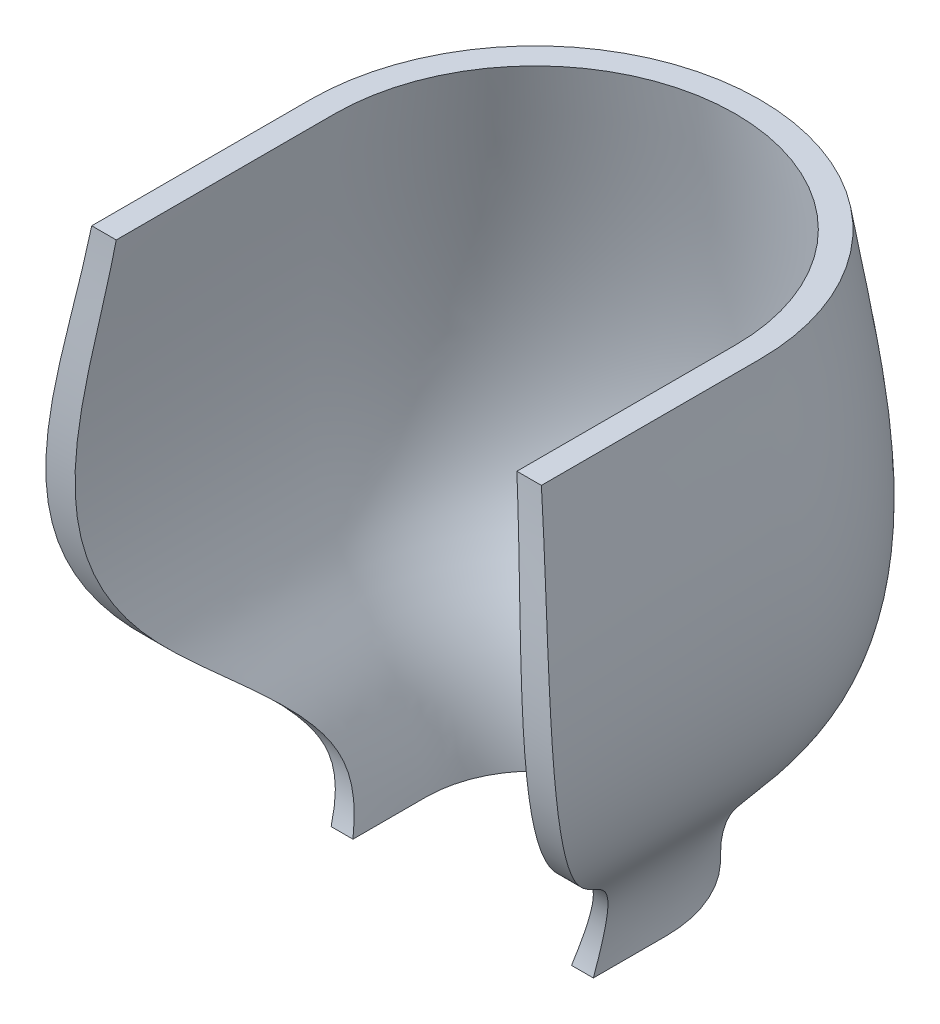
ISO-10303-21;
HEADER;
FILE_DESCRIPTION(('STEP AP214'),'2;1');
FILE_NAME('part.step','',(''),(''),'','','');
FILE_SCHEMA(('AUTOMOTIVE_DESIGN { 1 0 10303 214 1 1 1 1 }'));
ENDSEC;
DATA;
#1=APPLICATION_CONTEXT('core data for automotive mechanical design processes');
#2=APPLICATION_PROTOCOL_DEFINITION('international standard','automotive_design',2000,#1);
#3=PRODUCT_CONTEXT('',#1,'mechanical');
#4=PRODUCT('Part','Part','',(#3));
#5=PRODUCT_RELATED_PRODUCT_CATEGORY('part','',(#4));
#6=PRODUCT_DEFINITION_FORMATION('','',#4);
#7=PRODUCT_DEFINITION_CONTEXT('part definition',#1,'design');
#8=PRODUCT_DEFINITION('design','',#6,#7);
#9=PRODUCT_DEFINITION_SHAPE('','',#8);
#10=(LENGTH_UNIT() NAMED_UNIT(*) SI_UNIT(.MILLI.,.METRE.));
#11=(NAMED_UNIT(*) PLANE_ANGLE_UNIT() SI_UNIT($,.RADIAN.));
#12=(NAMED_UNIT(*) SI_UNIT($,.STERADIAN.) SOLID_ANGLE_UNIT());
#13=UNCERTAINTY_MEASURE_WITH_UNIT(LENGTH_MEASURE(1.E-05),#10,'distance_accuracy_value','');
#14=(GEOMETRIC_REPRESENTATION_CONTEXT(3) GLOBAL_UNCERTAINTY_ASSIGNED_CONTEXT((#13)) GLOBAL_UNIT_ASSIGNED_CONTEXT((#10,
#11,#12)) REPRESENTATION_CONTEXT('',''));
#15=CARTESIAN_POINT('',(0.,0.,0.));
#16=DIRECTION('',(0.,0.,1.));
#17=DIRECTION('',(1.,0.,0.));
#18=AXIS2_PLACEMENT_3D('',#15,#16,#17);
#19=CARTESIAN_POINT('',(0.,15.,0.));
#20=DIRECTION('',(0.,1.,0.));
#21=DIRECTION('',(0.,0.,1.));
#22=AXIS2_PLACEMENT_3D('',#19,#20,#21);
#23=PLANE('',#22);
#24=CARTESIAN_POINT('',(0.,15.,0.));
#25=DIRECTION('',(0.,-1.,0.));
#26=DIRECTION('',(0.,0.,1.));
#27=AXIS2_PLACEMENT_3D('',#24,#25,#26);
#28=CIRCLE('',#27,5.5);
#29=CARTESIAN_POINT('',(-5.5,15.,0.));
#30=VERTEX_POINT('',#29);
#31=CARTESIAN_POINT('',(5.5,15.,0.));
#32=VERTEX_POINT('',#31);
#33=EDGE_CURVE('E419',#30,#32,#28,.T.);
#34=ORIENTED_EDGE('',*,*,#33,.T.);
#35=DIRECTION('',(0.,0.,1.));
#36=VECTOR('',#35,1.);
#37=CARTESIAN_POINT('',(5.5,15.,0.));
#38=LINE('',#37,#36);
#39=CARTESIAN_POINT('',(5.5,15.,6.));
#40=VERTEX_POINT('',#39);
#41=EDGE_CURVE('E12',#32,#40,#38,.T.);
#42=ORIENTED_EDGE('',*,*,#41,.T.);
#43=DIRECTION('',(1.,0.,0.));
#44=VECTOR('',#43,1.);
#45=CARTESIAN_POINT('',(6.17309138782306,15.,6.));
#46=LINE('',#45,#44);
#47=CARTESIAN_POINT('',(6.17309138782306,15.,6.));
#48=VERTEX_POINT('',#47);
#49=EDGE_CURVE('E285',#40,#48,#46,.T.);
#50=ORIENTED_EDGE('',*,*,#49,.T.);
#51=DIRECTION('',(0.,0.,-1.));
#52=VECTOR('',#51,1.);
#53=CARTESIAN_POINT('',(6.17309138782306,15.,0.));
#54=LINE('',#53,#52);
#55=CARTESIAN_POINT('',(6.17309138782306,15.,0.));
#56=VERTEX_POINT('',#55);
#57=EDGE_CURVE('E580',#48,#56,#54,.T.);
#58=ORIENTED_EDGE('',*,*,#57,.T.);
#59=CARTESIAN_POINT('',(0.,15.,0.));
#60=DIRECTION('',(0.,1.,0.));
#61=DIRECTION('',(0.,0.,-1.));
#62=AXIS2_PLACEMENT_3D('',#59,#60,#61);
#63=CIRCLE('',#62,6.17309138782306);
#64=CARTESIAN_POINT('',(-6.17309138782306,15.,0.));
#65=VERTEX_POINT('',#64);
#66=EDGE_CURVE('E569',#56,#65,#63,.T.);
#67=ORIENTED_EDGE('',*,*,#66,.T.);
#68=DIRECTION('',(0.,0.,1.));
#69=VECTOR('',#68,1.);
#70=CARTESIAN_POINT('',(-6.17309138782306,15.,0.));
#71=LINE('',#70,#69);
#72=CARTESIAN_POINT('',(-6.17309138782306,15.,6.));
#73=VERTEX_POINT('',#72);
#74=EDGE_CURVE('E558',#65,#73,#71,.T.);
#75=ORIENTED_EDGE('',*,*,#74,.T.);
#76=DIRECTION('',(1.,0.,0.));
#77=VECTOR('',#76,1.);
#78=CARTESIAN_POINT('',(-6.17309138782306,15.,6.));
#79=LINE('',#78,#77);
#80=CARTESIAN_POINT('',(-5.5,15.,6.));
#81=VERTEX_POINT('',#80);
#82=EDGE_CURVE('E299',#73,#81,#79,.T.);
#83=ORIENTED_EDGE('',*,*,#82,.T.);
#84=DIRECTION('',(0.,0.,-1.));
#85=VECTOR('',#84,1.);
#86=CARTESIAN_POINT('',(-5.5,15.,0.));
#87=LINE('',#86,#85);
#88=EDGE_CURVE('E293',#81,#30,#87,.T.);
#89=ORIENTED_EDGE('',*,*,#88,.T.);
#90=EDGE_LOOP('',(#34,#42,#50,#58,#67,#75,#83,#89));
#91=FACE_BOUND('',#90,.T.);
#92=ADVANCED_FACE('F275',(#91),#23,.T.);
#93=CARTESIAN_POINT('',(0.,0.,0.));
#94=DIRECTION('',(0.,1.,0.));
#95=DIRECTION('',(0.,0.,1.));
#96=AXIS2_PLACEMENT_3D('',#93,#94,#95);
#97=PLANE('',#96);
#98=CARTESIAN_POINT('',(0.,0.,0.));
#99=DIRECTION('',(0.,-1.,0.));
#100=DIRECTION('',(0.,0.,1.));
#101=AXIS2_PLACEMENT_3D('',#98,#99,#100);
#102=CIRCLE('',#101,3.);
#103=CARTESIAN_POINT('',(-3.,0.,1.92756340340493E-11));
#104=VERTEX_POINT('',#103);
#105=CARTESIAN_POINT('',(3.,0.,0.));
#106=VERTEX_POINT('',#105);
#107=EDGE_CURVE('E349',#104,#106,#102,.T.);
#108=ORIENTED_EDGE('',*,*,#107,.F.);
#109=DIRECTION('',(0.,0.,-1.));
#110=VECTOR('',#109,1.);
#111=CARTESIAN_POINT('',(-3.,0.,0.));
#112=LINE('',#111,#110);
#113=CARTESIAN_POINT('',(-3.,0.,2.));
#114=VERTEX_POINT('',#113);
#115=EDGE_CURVE('E364',#114,#104,#112,.T.);
#116=ORIENTED_EDGE('',*,*,#115,.F.);
#117=DIRECTION('',(1.,0.,0.));
#118=VECTOR('',#117,1.);
#119=CARTESIAN_POINT('',(-3.,0.,2.));
#120=LINE('',#119,#118);
#121=CARTESIAN_POINT('',(-3.6,0.,2.));
#122=VERTEX_POINT('',#121);
#123=EDGE_CURVE('E491',#122,#114,#120,.T.);
#124=ORIENTED_EDGE('',*,*,#123,.F.);
#125=DIRECTION('',(0.,0.,1.));
#126=VECTOR('',#125,1.);
#127=CARTESIAN_POINT('',(-3.6,0.,2.));
#128=LINE('',#127,#126);
#129=CARTESIAN_POINT('',(-3.6,0.,5.08375436157414E-12));
#130=VERTEX_POINT('',#129);
#131=EDGE_CURVE('E494',#130,#122,#128,.T.);
#132=ORIENTED_EDGE('',*,*,#131,.F.);
#133=CARTESIAN_POINT('',(0.,0.,0.));
#134=DIRECTION('',(0.,1.,0.));
#135=DIRECTION('',(0.,0.,1.));
#136=AXIS2_PLACEMENT_3D('',#133,#134,#135);
#137=CIRCLE('',#136,3.6);
#138=CARTESIAN_POINT('',(3.6,0.,1.98340484700276E-11));
#139=VERTEX_POINT('',#138);
#140=EDGE_CURVE('E723',#139,#130,#137,.T.);
#141=ORIENTED_EDGE('',*,*,#140,.F.);
#142=DIRECTION('',(0.,0.,-1.));
#143=VECTOR('',#142,1.);
#144=CARTESIAN_POINT('',(3.6,0.,0.));
#145=LINE('',#144,#143);
#146=CARTESIAN_POINT('',(3.6,0.,2.));
#147=VERTEX_POINT('',#146);
#148=EDGE_CURVE('E721',#147,#139,#145,.T.);
#149=ORIENTED_EDGE('',*,*,#148,.F.);
#150=DIRECTION('',(1.,0.,0.));
#151=VECTOR('',#150,1.);
#152=CARTESIAN_POINT('',(3.6,0.,2.));
#153=LINE('',#152,#151);
#154=CARTESIAN_POINT('',(3.,0.,2.));
#155=VERTEX_POINT('',#154);
#156=EDGE_CURVE('E352',#155,#147,#153,.T.);
#157=ORIENTED_EDGE('',*,*,#156,.F.);
#158=DIRECTION('',(0.,0.,1.));
#159=VECTOR('',#158,1.);
#160=CARTESIAN_POINT('',(3.,0.,0.));
#161=LINE('',#160,#159);
#162=EDGE_CURVE('E344',#106,#155,#161,.T.);
#163=ORIENTED_EDGE('',*,*,#162,.F.);
#164=EDGE_LOOP('',(#108,#116,#124,#132,#141,#149,#157,#163));
#165=FACE_BOUND('',#164,.T.);
#166=ADVANCED_FACE('F347',(#165),#97,.F.);
#167=CARTESIAN_POINT('',(3.6,0.,2.));
#168=CARTESIAN_POINT('',(3.63378733645295,0.880805041264477,1.72848302475869));
#169=CARTESIAN_POINT('',(3.97507350168737,2.62820826771268,1.75640971282368));
#170=CARTESIAN_POINT('',(8.10749416501325,6.05138972374329,7.76235091423386));
#171=CARTESIAN_POINT('',(6.68470618092911,11.3939465903955,6.27506048935247));
#172=CARTESIAN_POINT('',(6.17309138782306,15.,6.));
#173=CARTESIAN_POINT('',(3.6,0.,1.83333333333333));
#174=CARTESIAN_POINT('',(3.62471836638207,0.863174329969295,1.57757899521862));
#175=CARTESIAN_POINT('',(3.98360409205015,2.64509496403198,1.61661494302488));
#176=CARTESIAN_POINT('',(8.09880192888228,6.03083875568255,7.10750482242825));
#177=CARTESIAN_POINT('',(6.68940158007798,11.4221003820902,5.76300999523385));
#178=CARTESIAN_POINT('',(6.17309138782306,15.,5.5));
#179=CARTESIAN_POINT('',(3.6,0.,1.51338273172282));
#180=CARTESIAN_POINT('',(3.60658042624031,0.827912907378931,1.28915366786129));
#181=CARTESIAN_POINT('',(4.00066527277571,2.67886835667056,1.36761618740887));
#182=CARTESIAN_POINT('',(8.08141745662031,5.98973681956104,5.72387049812755));
#183=CARTESIAN_POINT('',(6.69879237837573,11.4784079654796,4.65527628475202));
#184=CARTESIAN_POINT('',(6.17309138782306,15.,4.4163672777554));
#185=CARTESIAN_POINT('',(3.6,0.,1.04318084861823));
#186=CARTESIAN_POINT('',(3.58178706109076,0.779854719190685,0.901582387567392));
#187=CARTESIAN_POINT('',(4.0239571158437,2.72470639486982,0.985234840899981));
#188=CARTESIAN_POINT('',(8.05801205421266,5.93603706561916,3.62049125680946));
#189=CARTESIAN_POINT('',(6.70976414698317,11.5430736269056,2.92122466421897));
#190=CARTESIAN_POINT('',(6.17309138782306,15.,2.71944483088843));
#191=CARTESIAN_POINT('',(3.6,0.,0.556518566173948));
#192=CARTESIAN_POINT('',(3.56885456884008,0.754268538743175,0.50643519872563));
#193=CARTESIAN_POINT('',(4.03608651284339,2.74904721571967,0.554069384620787));
#194=CARTESIAN_POINT('',(8.04604354001792,5.90821194447367,1.64980372790429));
#195=CARTESIAN_POINT('',(6.71423704501665,11.5735188970257,1.32352566742525));
#196=CARTESIAN_POINT('',(6.17309138782306,15.,1.21639660480663));
#197=CARTESIAN_POINT('',(3.6,0.,0.200478132085779));
#198=CARTESIAN_POINT('',(3.56735574841099,0.75249184537389,0.187481323852453));
#199=CARTESIAN_POINT('',(4.03751372883938,2.75073546293678,0.224445582904076));
#200=CARTESIAN_POINT('',(8.04439729596179,5.90630354404947,0.490431123090516));
#201=CARTESIAN_POINT('',(6.71610524306161,11.5755092236256,0.416639560683462));
#202=CARTESIAN_POINT('',(6.17309138782306,15.,0.382487677944104));
#203=CARTESIAN_POINT('',(3.6,0.,-0.454333161703371));
#204=CARTESIAN_POINT('',(3.56784184514748,0.750902268652003,-0.424879171196963));
#205=CARTESIAN_POINT('',(4.03701074644811,2.75224599363041,-0.508649348791384));
#206=CARTESIAN_POINT('',(8.04541529668461,5.90459510287306,-1.11143854150805));
#207=CARTESIAN_POINT('',(6.71297785797902,11.5772952911264,-0.944208562496829));
#208=CARTESIAN_POINT('',(6.17309138782306,15.,-0.866811927190997));
#209=CARTESIAN_POINT('',(3.42573012458147,0.,-1.37548116502775));
#210=CARTESIAN_POINT('',(3.40347296308286,0.752822402441901,-1.34409121645522));
#211=CARTESIAN_POINT('',(3.85273623907725,2.75042183285671,-1.50377343540029));
#212=CARTESIAN_POINT('',(7.57062119868505,5.90665291562616,-3.32408839005759));
#213=CARTESIAN_POINT('',(6.32249267053412,11.5751685563715,-2.75481717722436));
#214=CARTESIAN_POINT('',(5.80637590168523,15.,-2.54662936819127));
#215=CARTESIAN_POINT('',(2.64386436560828,0.,-2.5811408850031));
#216=CARTESIAN_POINT('',(2.64163920177374,0.752223342452932,-2.53543153111106));
#217=CARTESIAN_POINT('',(2.99256718620641,2.75099118659118,-2.8690938422633));
#218=CARTESIAN_POINT('',(5.704672011933,5.90600805004966,-5.96113474783748));
#219=CARTESIAN_POINT('',(4.77197850826184,11.5758469251665,-4.96606412860172));
#220=CARTESIAN_POINT('',(4.37904880206593,15.,-4.57075103356579));
#221=CARTESIAN_POINT('',(1.44029218668137,0.,-3.40492770459007));
#222=CARTESIAN_POINT('',(1.44533727976925,0.752152643275783,-3.3694942026304));
#223=CARTESIAN_POINT('',(1.63889190969212,2.75105794998842,-3.81110556494298));
#224=CARTESIAN_POINT('',(3.04987642540131,5.90593713425401,-7.65794663897039));
#225=CARTESIAN_POINT('',(2.55656880530634,11.5758999550242,-6.38806741659591));
#226=CARTESIAN_POINT('',(2.34467874284067,15.,-5.87401176247165));
#227=CARTESIAN_POINT('',(0.,0.,-3.69778475309506));
#228=CARTESIAN_POINT('',(0.,0.751918965280204,-3.66679986403619));
#229=CARTESIAN_POINT('',(0.,2.75127973614995,-4.15083629579946));
#230=CARTESIAN_POINT('',(0.,5.90568926003599,-8.23815255174372));
#231=CARTESIAN_POINT('',(0.,11.5761454462801,-6.8788143934773));
#232=CARTESIAN_POINT('',(0.,15.,-6.32275628352262));
#233=CARTESIAN_POINT('',(-1.44029218668137,0.,-3.40492770459006));
#234=CARTESIAN_POINT('',(-1.44533727976922,0.752152643275795,-3.3694942026304));
#235=CARTESIAN_POINT('',(-1.63889190969204,2.75105794998847,-3.811105564943));
#236=CARTESIAN_POINT('',(-3.0498764254012,5.90593713425406,-7.65794663897042));
#237=CARTESIAN_POINT('',(-2.55656880530628,11.5758999550242,-6.38806741659593));
#238=CARTESIAN_POINT('',(-2.34467874284066,15.,-5.87401176247166));
#239=CARTESIAN_POINT('',(-2.64386436560828,0.,-2.5811408850031));
#240=CARTESIAN_POINT('',(-2.6416392017737,0.752223342452946,-2.53543153111105));
#241=CARTESIAN_POINT('',(-2.99256718620631,2.75099118659123,-2.86909384226329));
#242=CARTESIAN_POINT('',(-5.70467201193292,5.90600805004974,-5.96113474783748));
#243=CARTESIAN_POINT('',(-4.77197850826179,11.5758469251665,-4.96606412860173));
#244=CARTESIAN_POINT('',(-4.37904880206593,15.,-4.57075103356579));
#245=CARTESIAN_POINT('',(-3.42573012458147,0.,-1.37548116502775));
#246=CARTESIAN_POINT('',(-3.40347296308282,0.752822402441925,-1.34409121645523));
#247=CARTESIAN_POINT('',(-3.85273623907716,2.75042183285679,-1.5037734354003));
#248=CARTESIAN_POINT('',(-7.57062119868495,5.90665291562626,-3.32408839005759));
#249=CARTESIAN_POINT('',(-6.32249267053407,11.5751685563715,-2.75481717722437));
#250=CARTESIAN_POINT('',(-5.80637590168522,15.,-2.54662936819127));
#251=CARTESIAN_POINT('',(-3.6,0.,-0.454333161703372));
#252=CARTESIAN_POINT('',(-3.56784184514745,0.750902268652022,-0.424879171196963));
#253=CARTESIAN_POINT('',(-4.037010746448,2.75224599363049,-0.508649348791382));
#254=CARTESIAN_POINT('',(-8.04541529668454,5.90459510287315,-1.11143854150805));
#255=CARTESIAN_POINT('',(-6.71297785797897,11.5772952911265,-0.944208562496831));
#256=CARTESIAN_POINT('',(-6.17309138782306,15.,-0.866811927191));
#257=CARTESIAN_POINT('',(-3.6,0.,0.200478132085779));
#258=CARTESIAN_POINT('',(-3.56735574841097,0.752491845373906,0.187481323852452));
#259=CARTESIAN_POINT('',(-4.03751372883936,2.75073546293687,0.224445582904076));
#260=CARTESIAN_POINT('',(-8.0443972959616,5.90630354404957,0.490431123090514));
#261=CARTESIAN_POINT('',(-6.71610524306154,11.5755092236257,0.416639560683463));
#262=CARTESIAN_POINT('',(-6.17309138782306,15.,0.382487677944106));
#263=CARTESIAN_POINT('',(-3.6,0.,0.556518566173947));
#264=CARTESIAN_POINT('',(-3.56885456884007,0.754268538743189,0.506435198725628));
#265=CARTESIAN_POINT('',(-4.03608651284337,2.74904721571975,0.554069384620791));
#266=CARTESIAN_POINT('',(-8.04604354001773,5.90821194447378,1.64980372790428));
#267=CARTESIAN_POINT('',(-6.71423704501658,11.5735188970258,1.32352566742524));
#268=CARTESIAN_POINT('',(-6.17309138782307,15.,1.21639660480663));
#269=CARTESIAN_POINT('',(-3.6,0.,1.04318084861823));
#270=CARTESIAN_POINT('',(-3.58178706109075,0.779854719190703,0.901582387567389));
#271=CARTESIAN_POINT('',(-4.02395711584367,2.72470639486991,0.985234840899984));
#272=CARTESIAN_POINT('',(-8.05801205421249,5.93603706561924,3.62049125680945));
#273=CARTESIAN_POINT('',(-6.70976414698311,11.5430736269056,2.92122466421897));
#274=CARTESIAN_POINT('',(-6.17309138782305,15.,2.71944483088844));
#275=CARTESIAN_POINT('',(-3.6,0.,1.51338273172282));
#276=CARTESIAN_POINT('',(-3.60658042624029,0.827912907378949,1.28915366786128));
#277=CARTESIAN_POINT('',(-4.00066527277569,2.67886835667064,1.36761618740888));
#278=CARTESIAN_POINT('',(-8.08141745662018,5.98973681956116,5.72387049812755));
#279=CARTESIAN_POINT('',(-6.69879237837568,11.4784079654796,4.65527628475202));
#280=CARTESIAN_POINT('',(-6.17309138782306,15.,4.4163672777554));
#281=CARTESIAN_POINT('',(-3.6,0.,1.83333333333333));
#282=CARTESIAN_POINT('',(-3.62471836638206,0.863174329969314,1.57757899521861));
#283=CARTESIAN_POINT('',(-3.98360409205012,2.64509496403206,1.61661494302488));
#284=CARTESIAN_POINT('',(-8.09880192888214,6.03083875568265,7.10750482242824));
#285=CARTESIAN_POINT('',(-6.68940158007793,11.4221003820902,5.76300999523385));
#286=CARTESIAN_POINT('',(-6.17309138782306,15.,5.5));
#287=CARTESIAN_POINT('',(-3.6,0.,2.));
#288=CARTESIAN_POINT('',(-3.63378733645294,0.880805041264497,1.72848302475869));
#289=CARTESIAN_POINT('',(-3.97507350168734,2.62820826771277,1.75640971282368));
#290=CARTESIAN_POINT('',(-8.10749416501311,6.05138972374339,7.76235091423385));
#291=CARTESIAN_POINT('',(-6.68470618092906,11.3939465903955,6.27506048935247));
#292=CARTESIAN_POINT('',(-6.17309138782306,15.,6.));
#293=B_SPLINE_SURFACE_WITH_KNOTS('',3,3,((#167,#168,#169,#170,#171,#172),(#173,#174,#175,#176,
#177,#178),(#179,#180,#181,#182,#183,#184),(#185,#186,#187,#188,#189,#190),(#191,#192,#193,#194,
#195,#196),(#197,#198,#199,#200,#201,#202),(#203,#204,#205,#206,#207,#208),(#209,#210,#211,#212,
#213,#214),(#215,#216,#217,#218,#219,#220),(#221,#222,#223,#224,#225,#226),(#227,#228,#229,#230,
#231,#232),(#233,#234,#235,#236,#237,#238),(#239,#240,#241,#242,#243,#244),(#245,#246,#247,#248,
#249,#250),(#251,#252,#253,#254,#255,#256),(#257,#258,#259,#260,#261,#262),(#263,#264,#265,#266,
#267,#268),(#269,#270,#271,#272,#273,#274),(#275,#276,#277,#278,#279,#280),(#281,#282,#283,#284,
#285,#286),(#287,#288,#289,#290,#291,#292)),.UNSPECIFIED.,.F.,.F.,.F.,(4,1,1,1,2,1,1,1,1,1,1,1,
2,1,1,1,4),(4,1,1,4),(0.,0.0382702109900404,0.0765404219800809,0.114810632970121,
0.153080843960162,0.239810632970121,0.326540421980081,0.41327021099004,0.5,0.586729789009959,
0.673459578019919,0.760189367029879,0.846919156039838,0.885189367029878,0.923459578019919,
0.961729789009959,1.),(0.,0.127439463436355,0.381077952582485,1.),.UNSPECIFIED.);
#294=CARTESIAN_POINT('',(-3.6,0.,2.));
#295=CARTESIAN_POINT('',(-3.63378733645294,0.880805041264497,1.72848302475869));
#296=CARTESIAN_POINT('',(-3.97507350168734,2.62820826771277,1.75640971282368));
#297=CARTESIAN_POINT('',(-8.10749416501311,6.05138972374339,7.76235091423385));
#298=CARTESIAN_POINT('',(-6.68470618092906,11.3939465903955,6.27506048935247));
#299=CARTESIAN_POINT('',(-6.17309138782306,15.,6.));
#300=B_SPLINE_CURVE_WITH_KNOTS('',3,(#294,#295,#296,#297,#298,#299),.UNSPECIFIED.,.F.,.F.,(4,1,
1,4),(0.,0.127439463436355,0.381077952582485,1.),.UNSPECIFIED.);
#301=EDGE_CURVE('E507',#122,#73,#300,.T.);
#302=CARTESIAN_POINT('',(3.6,0.,2.));
#303=CARTESIAN_POINT('',(3.63378733645295,0.880805041264477,1.72848302475869));
#304=CARTESIAN_POINT('',(3.97507350168737,2.62820826771268,1.75640971282368));
#305=CARTESIAN_POINT('',(8.10749416501325,6.05138972374329,7.76235091423386));
#306=CARTESIAN_POINT('',(6.68470618092911,11.3939465903955,6.27506048935247));
#307=CARTESIAN_POINT('',(6.17309138782306,15.,6.));
#308=B_SPLINE_CURVE_WITH_KNOTS('',3,(#302,#303,#304,#305,#306,#307),.UNSPECIFIED.,.F.,.F.,(4,1,
1,4),(0.,0.127439463436355,0.381077952582485,1.),.UNSPECIFIED.);
#309=EDGE_CURVE('E357',#48,#147,#308,.F.);
#310=ORIENTED_EDGE('',*,*,#148,.T.);
#311=ORIENTED_EDGE('',*,*,#140,.T.);
#312=ORIENTED_EDGE('',*,*,#131,.T.);
#313=ORIENTED_EDGE('',*,*,#301,.T.);
#314=ORIENTED_EDGE('',*,*,#74,.F.);
#315=ORIENTED_EDGE('',*,*,#66,.F.);
#316=ORIENTED_EDGE('',*,*,#57,.F.);
#317=ORIENTED_EDGE('',*,*,#309,.T.);
#318=EDGE_LOOP('',(#310,#311,#312,#313,#314,#315,#316,#317));
#319=FACE_BOUND('',#318,.T.);
#320=ADVANCED_FACE('F446',(#319),#293,.T.);
#321=CARTESIAN_POINT('',(-3.6,0.,2.));
#322=CARTESIAN_POINT('',(-3.63378733645294,0.880805041264497,1.72848302475869));
#323=CARTESIAN_POINT('',(-3.97507350168734,2.62820826771277,1.75640971282368));
#324=CARTESIAN_POINT('',(-8.10749416501311,6.05138972374339,7.76235091423385));
#325=CARTESIAN_POINT('',(-6.68470618092906,11.3939465903955,6.27506048935247));
#326=CARTESIAN_POINT('',(-6.17309138782306,15.,6.));
#327=CARTESIAN_POINT('',(-3.4,0.,2.));
#328=CARTESIAN_POINT('',(-3.47649314493688,0.872917646557287,1.72375058793436));
#329=CARTESIAN_POINT('',(-3.87944297271407,2.63565817447065,1.76085168173503));
#330=CARTESIAN_POINT('',(-7.76816742948004,6.04345886945036,7.75793005019175));
#331=CARTESIAN_POINT('',(-6.43979027664976,11.3999632389511,6.27691176583109));
#332=CARTESIAN_POINT('',(-5.94872759188204,15.,6.));
#333=CARTESIAN_POINT('',(-3.2,0.,2.));
#334=CARTESIAN_POINT('',(-3.31919895342081,0.865030251850078,1.71901815111004));
#335=CARTESIAN_POINT('',(-3.78381244374081,2.64310808122853,1.76529365064638));
#336=CARTESIAN_POINT('',(-7.42884069394696,6.03552801515733,7.75350918614966));
#337=CARTESIAN_POINT('',(-6.19487437237045,11.4059798875066,6.27876304230971));
#338=CARTESIAN_POINT('',(-5.72436379594102,15.,6.));
#339=CARTESIAN_POINT('',(-3.,0.,2.));
#340=CARTESIAN_POINT('',(-3.16190476190475,0.857142857142869,1.71428571428571));
#341=CARTESIAN_POINT('',(-3.68818191476754,2.65055798798642,1.76973561955773));
#342=CARTESIAN_POINT('',(-7.08951395841389,6.0275971608643,7.74908832210756));
#343=CARTESIAN_POINT('',(-5.94995846809114,11.4119965360621,6.28061431878833));
#344=CARTESIAN_POINT('',(-5.5,15.,6.));
#345=B_SPLINE_SURFACE_WITH_KNOTS('',3,3,((#321,#322,#323,#324,#325,#326),(#327,#328,#329,#330,
#331,#332),(#333,#334,#335,#336,#337,#338),(#339,#340,#341,#342,#343,#344)),.UNSPECIFIED.,.F.,
.F.,.F.,(4,4),(4,1,1,4),(0.,1.),(0.,0.127439463436355,0.381077952582485,1.),.UNSPECIFIED.);
#346=CARTESIAN_POINT('',(-3.,0.,2.));
#347=CARTESIAN_POINT('',(-3.16190476190475,0.857142857142869,1.71428571428571));
#348=CARTESIAN_POINT('',(-3.68818191476754,2.65055798798642,1.76973561955773));
#349=CARTESIAN_POINT('',(-7.08951395841389,6.0275971608643,7.74908832210756));
#350=CARTESIAN_POINT('',(-5.94995846809114,11.4119965360621,6.28061431878833));
#351=CARTESIAN_POINT('',(-5.5,15.,6.));
#352=B_SPLINE_CURVE_WITH_KNOTS('',3,(#346,#347,#348,#349,#350,#351),.UNSPECIFIED.,.F.,.F.,(4,1,
1,4),(0.,0.127439463436355,0.381077952582485,1.),.UNSPECIFIED.);
#353=EDGE_CURVE('E505',#114,#81,#352,.T.);
#354=ORIENTED_EDGE('',*,*,#123,.T.);
#355=ORIENTED_EDGE('',*,*,#353,.T.);
#356=ORIENTED_EDGE('',*,*,#82,.F.);
#357=ORIENTED_EDGE('',*,*,#301,.F.);
#358=EDGE_LOOP('',(#354,#355,#356,#357));
#359=FACE_BOUND('',#358,.T.);
#360=ADVANCED_FACE('F504',(#359),#345,.T.);
#361=CARTESIAN_POINT('',(3.,0.,2.));
#362=CARTESIAN_POINT('',(3.16190476190477,0.857142857142848,1.71428571428572));
#363=CARTESIAN_POINT('',(3.68818191476758,2.65055798798634,1.76973561955772));
#364=CARTESIAN_POINT('',(7.08951395841385,6.02759716086421,7.74908832210756));
#365=CARTESIAN_POINT('',(5.94995846809114,11.4119965360621,6.28061431878833));
#366=CARTESIAN_POINT('',(5.5,15.,6.));
#367=CARTESIAN_POINT('',(3.2,0.,2.));
#368=CARTESIAN_POINT('',(3.31919895342083,0.865030251850057,1.71901815111004));
#369=CARTESIAN_POINT('',(3.78381244374084,2.64310808122846,1.76529365064637));
#370=CARTESIAN_POINT('',(7.42884069394698,6.03552801515724,7.75350918614966));
#371=CARTESIAN_POINT('',(6.19487437237046,11.4059798875065,6.27876304230971));
#372=CARTESIAN_POINT('',(5.72436379594102,15.,6.));
#373=CARTESIAN_POINT('',(3.4,0.,2.));
#374=CARTESIAN_POINT('',(3.47649314493689,0.872917646557267,1.72375058793437));
#375=CARTESIAN_POINT('',(3.87944297271411,2.63565817447057,1.76085168173503));
#376=CARTESIAN_POINT('',(7.76816742948011,6.04345886945026,7.75793005019176));
#377=CARTESIAN_POINT('',(6.43979027664979,11.399963238951,6.27691176583109));
#378=CARTESIAN_POINT('',(5.94872759188204,15.,6.));
#379=CARTESIAN_POINT('',(3.6,0.,2.));
#380=CARTESIAN_POINT('',(3.63378733645296,0.880805041264477,1.7284830247587));
#381=CARTESIAN_POINT('',(3.97507350168737,2.62820826771269,1.75640971282368));
#382=CARTESIAN_POINT('',(8.10749416501325,6.05138972374329,7.76235091423386));
#383=CARTESIAN_POINT('',(6.68470618092911,11.3939465903955,6.27506048935247));
#384=CARTESIAN_POINT('',(6.17309138782306,15.,6.));
#385=B_SPLINE_SURFACE_WITH_KNOTS('',3,3,((#361,#362,#363,#364,#365,#366),(#367,#368,#369,#370,
#371,#372),(#373,#374,#375,#376,#377,#378),(#379,#380,#381,#382,#383,#384)),.UNSPECIFIED.,.F.,
.F.,.F.,(4,4),(4,1,1,4),(0.,1.),(0.,0.127439463436355,0.381077952582485,1.),.UNSPECIFIED.);
#386=CARTESIAN_POINT('',(3.,0.,2.));
#387=CARTESIAN_POINT('',(3.16190476190477,0.857142857142847,1.71428571428572));
#388=CARTESIAN_POINT('',(3.68818191476758,2.65055798798634,1.76973561955772));
#389=CARTESIAN_POINT('',(7.08951395841385,6.02759716086421,7.74908832210756));
#390=CARTESIAN_POINT('',(5.94995846809114,11.4119965360621,6.28061431878833));
#391=CARTESIAN_POINT('',(5.5,15.,6.));
#392=B_SPLINE_CURVE_WITH_KNOTS('',3,(#386,#387,#388,#389,#390,#391),.UNSPECIFIED.,.F.,.F.,(4,1,
1,4),(0.,0.127439463436355,0.381077952582485,1.),.UNSPECIFIED.);
#393=EDGE_CURVE('E510',#155,#40,#392,.T.);
#394=ORIENTED_EDGE('',*,*,#156,.T.);
#395=ORIENTED_EDGE('',*,*,#309,.F.);
#396=ORIENTED_EDGE('',*,*,#49,.F.);
#397=ORIENTED_EDGE('',*,*,#393,.F.);
#398=EDGE_LOOP('',(#394,#395,#396,#397));
#399=FACE_BOUND('',#398,.T.);
#400=ADVANCED_FACE('F385',(#399),#385,.T.);
#401=CARTESIAN_POINT('',(-3.,0.,2.));
#402=CARTESIAN_POINT('',(-3.16190476190475,0.857142857142869,1.71428571428571));
#403=CARTESIAN_POINT('',(-3.68818191476754,2.65055798798641,1.76973561955773));
#404=CARTESIAN_POINT('',(-7.08951395841388,6.0275971608643,7.74908832210756));
#405=CARTESIAN_POINT('',(-5.94995846809114,11.4119965360621,6.28061431878832));
#406=CARTESIAN_POINT('',(-5.5,15.,6.));
#407=CARTESIAN_POINT('',(-3.,0.,1.83333333333333));
#408=CARTESIAN_POINT('',(-3.15254943126534,0.838425816432104,1.56463512241939));
#409=CARTESIAN_POINT('',(-3.69697084870676,2.66846281234273,1.62876186995193));
#410=CARTESIAN_POINT('',(-7.08068023035884,6.00604978562254,7.09544302566233));
#411=CARTESIAN_POINT('',(-5.95410951127168,11.4404794433147,5.76791785166499));
#412=CARTESIAN_POINT('',(-5.5,15.,5.5));
#413=CARTESIAN_POINT('',(-3.,0.,1.51032121586232));
#414=CARTESIAN_POINT('',(-3.13383876998654,0.800991735010573,1.27565515454906));
#415=CARTESIAN_POINT('',(-3.7145487165852,2.70427246105536,1.3813010283684));
#416=CARTESIAN_POINT('',(-7.06301277424873,5.96295503513902,5.71704081998849));
#417=CARTESIAN_POINT('',(-5.96241159763276,11.49744525782,4.66599161324489));
#418=CARTESIAN_POINT('',(-5.5,15.,4.42346669582657));
#419=CARTESIAN_POINT('',(-3.,0.,1.03324444862031));
#420=CARTESIAN_POINT('',(-3.10829302021632,0.749995926949469,0.889105068097844));
#421=CARTESIAN_POINT('',(-3.73852219906181,2.75285965203476,1.00067653496408));
#422=CARTESIAN_POINT('',(-7.03920101542755,5.90660957475044,3.62778921105284));
#423=CARTESIAN_POINT('',(-5.97213334557996,11.5627469877244,2.94518151295359));
#424=CARTESIAN_POINT('',(-5.5,15.,2.74343893898285));
#425=CARTESIAN_POINT('',(-3.,0.,0.543094302099927));
#426=CARTESIAN_POINT('',(-3.09469413137637,0.722434521648174,0.498176823113059));
#427=CARTESIAN_POINT('',(-3.75126422371125,2.77905850328327,0.567108050053858));
#428=CARTESIAN_POINT('',(-7.0267652755872,5.87689049901966,1.66146153382431));
#429=CARTESIAN_POINT('',(-5.97605803419089,11.594218993316,1.34389015555519));
#430=CARTESIAN_POINT('',(-5.5,15.,1.23611928744016));
#431=CARTESIAN_POINT('',(-3.,0.,0.191199136142654));
#432=CARTESIAN_POINT('',(-3.09327202876315,0.720496195759252,0.181829291403487));
#433=CARTESIAN_POINT('',(-3.75262199612605,2.78090037672109,0.235835536391592));
#434=CARTESIAN_POINT('',(-7.02515973458663,5.87480800161712,0.490045472066439));
#435=CARTESIAN_POINT('',(-5.97805750266248,11.5963929010226,0.423787757455837));
#436=CARTESIAN_POINT('',(-5.5,15.,0.389581201514031));
#437=CARTESIAN_POINT('',(-3.,0.,-0.380432843924907));
#438=CARTESIAN_POINT('',(-3.0934553122953,0.719012709109765,-0.361789471481832));
#439=CARTESIAN_POINT('',(-3.7524003608322,2.78231019926367,-0.469246805405112));
#440=CARTESIAN_POINT('',(-7.02592961919872,5.87321230061224,-0.97505352967946));
#441=CARTESIAN_POINT('',(-5.97486751707921,11.5980664474417,-0.843219195717275));
#442=CARTESIAN_POINT('',(-5.5,15.,-0.77515770950495));
#443=CARTESIAN_POINT('',(-2.85343188428118,0.,-1.15043486219017));
#444=CARTESIAN_POINT('',(-2.95324664948266,0.720783069958686,-1.16104719313596));
#445=CARTESIAN_POINT('',(-3.58566553726602,2.78062855051961,-1.38125762246195));
#446=CARTESIAN_POINT('',(-6.6055900402611,5.87510688431042,-2.92264930766809));
#447=CARTESIAN_POINT('',(-5.62529746885215,11.596119752703,-2.45840268942026));
#448=CARTESIAN_POINT('',(-5.17104018267874,15.,-2.27461177083581));
#449=CARTESIAN_POINT('',(-2.19963677666874,0.,-2.15443647406592));
#450=CARTESIAN_POINT('',(-2.29588505231163,0.720261236301143,-2.19260586434328));
#451=CARTESIAN_POINT('',(-2.79448989667174,2.78112453428288,-2.65399488941559));
#452=CARTESIAN_POINT('',(-4.96628707665608,5.87454482588367,-5.22094318036004));
#453=CARTESIAN_POINT('',(-4.24218538081973,11.5967123593867,-4.42507215719911));
#454=CARTESIAN_POINT('',(-3.89707759374523,15.,-4.07639618876972));
#455=CARTESIAN_POINT('',(-1.19723028880279,0.,-2.83832342714339));
#456=CARTESIAN_POINT('',(-1.2579154592733,0.720147792452704,-2.92040246137887));
#457=CARTESIAN_POINT('',(-1.53463687774283,2.78123169472788,-3.53876162583515));
#458=CARTESIAN_POINT('',(-2.6500019466446,5.87443064887268,-6.69172879762422));
#459=CARTESIAN_POINT('',(-2.2713067200153,11.5967994594138,-5.687056445693));
#460=CARTESIAN_POINT('',(-2.08557506597584,15.,-5.23445862574522));
#461=CARTESIAN_POINT('',(0.,0.,-3.0810390810182));
#462=CARTESIAN_POINT('',(0.,0.719914475604794,-3.18005603636481));
#463=CARTESIAN_POINT('',(0.,2.78145301717163,-3.85978893394187));
#464=CARTESIAN_POINT('',(0.,5.87418461754467,-7.19237744635869));
#465=CARTESIAN_POINT('',(0.,11.597036967581,-6.12210797325994));
#466=CARTESIAN_POINT('',(0.,15.,-5.6329023273665));
#467=CARTESIAN_POINT('',(1.19723028880279,0.,-2.83832342714339));
#468=CARTESIAN_POINT('',(1.25791545927334,0.720147792452695,-2.92040246137887));
#469=CARTESIAN_POINT('',(1.53463687774293,2.78123169472785,-3.53876162583515));
#470=CARTESIAN_POINT('',(2.65000194664468,5.87443064887266,-6.69172879762423));
#471=CARTESIAN_POINT('',(2.27130672001534,11.5967994594138,-5.68705644569302));
#472=CARTESIAN_POINT('',(2.08557506597584,15.,-5.23445862574523));
#473=CARTESIAN_POINT('',(2.19963677666873,0.,-2.15443647406592));
#474=CARTESIAN_POINT('',(2.29588505231166,0.720261236301127,-2.19260586434328));
#475=CARTESIAN_POINT('',(2.79448989667184,2.78112453428283,-2.65399488941559));
#476=CARTESIAN_POINT('',(4.96628707665615,5.87454482588358,-5.22094318036002));
#477=CARTESIAN_POINT('',(4.24218538081976,11.5967123593866,-4.42507215719911));
#478=CARTESIAN_POINT('',(3.89707759374521,15.,-4.07639618876972));
#479=CARTESIAN_POINT('',(2.85343188428118,0.,-1.15043486219017));
#480=CARTESIAN_POINT('',(2.9532466494827,0.720783069958667,-1.16104719313596));
#481=CARTESIAN_POINT('',(3.58566553726612,2.78062855051954,-1.38125762246196));
#482=CARTESIAN_POINT('',(6.60559004026117,5.87510688431035,-2.92264930766811));
#483=CARTESIAN_POINT('',(5.6252974688522,11.596119752703,-2.45840268942028));
#484=CARTESIAN_POINT('',(5.17104018267874,15.,-2.27461177083583));
#485=CARTESIAN_POINT('',(3.,0.,-0.380432843924908));
#486=CARTESIAN_POINT('',(3.09345531229533,0.719012709109742,-0.361789471481832));
#487=CARTESIAN_POINT('',(3.7524003608323,2.7823101992636,-0.469246805405109));
#488=CARTESIAN_POINT('',(7.02592961919879,5.87321230061216,-0.975053529679459));
#489=CARTESIAN_POINT('',(5.97486751707923,11.5980664474416,-0.84321919571728));
#490=CARTESIAN_POINT('',(5.5,15.,-0.775157709504953));
#491=CARTESIAN_POINT('',(3.,0.,0.191199136142653));
#492=CARTESIAN_POINT('',(3.09327202876318,0.720496195759229,0.181829291403488));
#493=CARTESIAN_POINT('',(3.75262199612611,2.78090037672102,0.235835536391594));
#494=CARTESIAN_POINT('',(7.02515973458657,5.87480800161703,0.490045472066434));
#495=CARTESIAN_POINT('',(5.97805750266247,11.5963929010226,0.423787757455838));
#496=CARTESIAN_POINT('',(5.5,15.,0.389581201514031));
#497=CARTESIAN_POINT('',(3.,0.,0.543094302099927));
#498=CARTESIAN_POINT('',(3.0946941313764,0.722434521648152,0.49817682311306));
#499=CARTESIAN_POINT('',(3.7512642237113,2.7790585032832,0.567108050053861));
#500=CARTESIAN_POINT('',(7.02676527558716,5.87689049901958,1.66146153382431));
#501=CARTESIAN_POINT('',(5.97605803419089,11.5942189933159,1.34389015555519));
#502=CARTESIAN_POINT('',(5.5,15.,1.23611928744016));
#503=CARTESIAN_POINT('',(3.,0.,1.03324444862031));
#504=CARTESIAN_POINT('',(3.10829302021634,0.749995926949445,0.889105068097843));
#505=CARTESIAN_POINT('',(3.73852219906185,2.75285965203469,1.00067653496408));
#506=CARTESIAN_POINT('',(7.03920101542749,5.90660957475033,3.62778921105283));
#507=CARTESIAN_POINT('',(5.97213334557994,11.5627469877244,2.94518151295358));
#508=CARTESIAN_POINT('',(5.49999999999999,15.,2.74343893898285));
#509=CARTESIAN_POINT('',(3.,0.,1.51032121586232));
#510=CARTESIAN_POINT('',(3.13383876998656,0.800991735010554,1.27565515454906));
#511=CARTESIAN_POINT('',(3.71454871658525,2.70427246105529,1.3813010283684));
#512=CARTESIAN_POINT('',(7.06301277424871,5.96295503513894,5.71704081998851));
#513=CARTESIAN_POINT('',(5.96241159763275,11.49744525782,4.66599161324488));
#514=CARTESIAN_POINT('',(5.5,15.,4.42346669582657));
#515=CARTESIAN_POINT('',(3.,0.,1.83333333333333));
#516=CARTESIAN_POINT('',(3.15254943126536,0.838425816432083,1.56463512241939));
#517=CARTESIAN_POINT('',(3.6969708487068,2.66846281234266,1.62876186995193));
#518=CARTESIAN_POINT('',(7.0806802303588,6.00604978562245,7.09544302566233));
#519=CARTESIAN_POINT('',(5.95410951127168,11.4404794433147,5.767917851665));
#520=CARTESIAN_POINT('',(5.5,15.,5.5));
#521=CARTESIAN_POINT('',(3.,0.,2.));
#522=CARTESIAN_POINT('',(3.16190476190477,0.857142857142847,1.71428571428572));
#523=CARTESIAN_POINT('',(3.68818191476758,2.65055798798634,1.76973561955772));
#524=CARTESIAN_POINT('',(7.08951395841385,6.02759716086421,7.74908832210756));
#525=CARTESIAN_POINT('',(5.94995846809114,11.4119965360621,6.28061431878833));
#526=CARTESIAN_POINT('',(5.5,15.,6.));
#527=B_SPLINE_SURFACE_WITH_KNOTS('',3,3,((#401,#402,#403,#404,#405,#406),(#407,#408,#409,#410,
#411,#412),(#413,#414,#415,#416,#417,#418),(#419,#420,#421,#422,#423,#424),(#425,#426,#427,#428,
#429,#430),(#431,#432,#433,#434,#435,#436),(#437,#438,#439,#440,#441,#442),(#443,#444,#445,#446,
#447,#448),(#449,#450,#451,#452,#453,#454),(#455,#456,#457,#458,#459,#460),(#461,#462,#463,#464,
#465,#466),(#467,#468,#469,#470,#471,#472),(#473,#474,#475,#476,#477,#478),(#479,#480,#481,#482,
#483,#484),(#485,#486,#487,#488,#489,#490),(#491,#492,#493,#494,#495,#496),(#497,#498,#499,#500,
#501,#502),(#503,#504,#505,#506,#507,#508),(#509,#510,#511,#512,#513,#514),(#515,#516,#517,#518,
#519,#520),(#521,#522,#523,#524,#525,#526)),.UNSPECIFIED.,.F.,.F.,.F.,(4,1,1,1,2,1,1,1,1,1,1,1,
2,1,1,1,4),(4,1,1,4),(0.,0.0418099279331424,0.0836198558662847,0.125429783799427,
0.167239711732569,0.250429783799427,0.333619855866285,0.416809927933142,0.5,0.583190072066858,
0.666380144133716,0.749570216200573,0.832760288267431,0.874570216200573,0.916380144133715,
0.958190072066858,1.),(0.,0.127439463436355,0.381077952582485,1.),.UNSPECIFIED.);
#528=ORIENTED_EDGE('',*,*,#115,.T.);
#529=ORIENTED_EDGE('',*,*,#107,.T.);
#530=ORIENTED_EDGE('',*,*,#162,.T.);
#531=ORIENTED_EDGE('',*,*,#393,.T.);
#532=ORIENTED_EDGE('',*,*,#41,.F.);
#533=ORIENTED_EDGE('',*,*,#33,.F.);
#534=ORIENTED_EDGE('',*,*,#88,.F.);
#535=ORIENTED_EDGE('',*,*,#353,.F.);
#536=EDGE_LOOP('',(#528,#529,#530,#531,#532,#533,#534,#535));
#537=FACE_BOUND('',#536,.T.);
#538=ADVANCED_FACE('F362',(#537),#527,.T.);
#539=CLOSED_SHELL('',(#92,#166,#320,#360,#400,#538));
#540=MANIFOLD_SOLID_BREP('B2',#539);
#541=ADVANCED_BREP_SHAPE_REPRESENTATION('',(#18,#540),#14);
#542=SHAPE_DEFINITION_REPRESENTATION(#9,#541);
ENDSEC;
END-ISO-10303-21;
